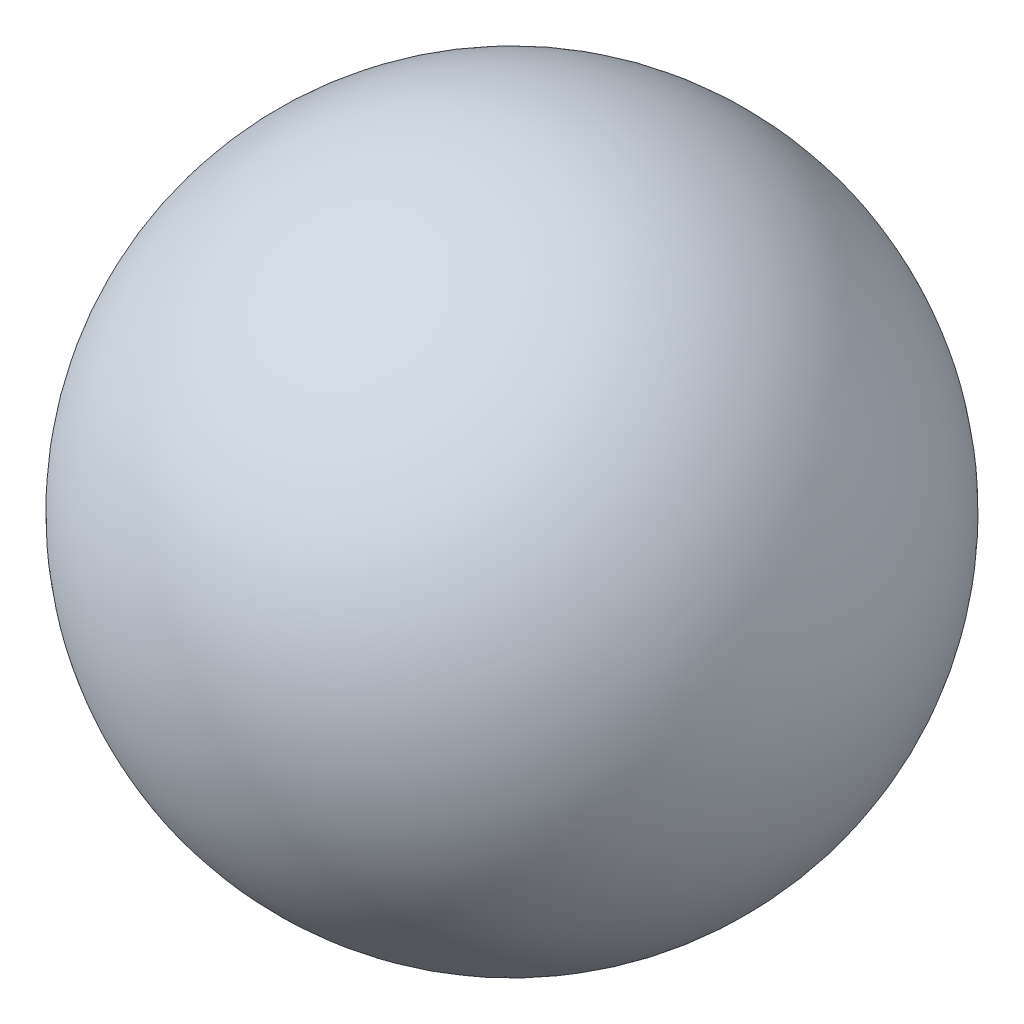
ISO-10303-21;
HEADER;
FILE_DESCRIPTION(('STEP AP214'),'2;1');
FILE_NAME('part.step','',(''),(''),'','','');
FILE_SCHEMA(('AUTOMOTIVE_DESIGN { 1 0 10303 214 1 1 1 1 }'));
ENDSEC;
DATA;
#1=APPLICATION_CONTEXT('core data for automotive mechanical design processes');
#2=APPLICATION_PROTOCOL_DEFINITION('international standard','automotive_design',2000,#1);
#3=PRODUCT_CONTEXT('',#1,'mechanical');
#4=PRODUCT('Part','Part','',(#3));
#5=PRODUCT_RELATED_PRODUCT_CATEGORY('part','',(#4));
#6=PRODUCT_DEFINITION_FORMATION('','',#4);
#7=PRODUCT_DEFINITION_CONTEXT('part definition',#1,'design');
#8=PRODUCT_DEFINITION('design','',#6,#7);
#9=PRODUCT_DEFINITION_SHAPE('','',#8);
#10=(LENGTH_UNIT() NAMED_UNIT(*) SI_UNIT(.MILLI.,.METRE.));
#11=(NAMED_UNIT(*) PLANE_ANGLE_UNIT() SI_UNIT($,.RADIAN.));
#12=(NAMED_UNIT(*) SI_UNIT($,.STERADIAN.) SOLID_ANGLE_UNIT());
#13=UNCERTAINTY_MEASURE_WITH_UNIT(LENGTH_MEASURE(1.E-05),#10,'distance_accuracy_value','');
#14=(GEOMETRIC_REPRESENTATION_CONTEXT(3) GLOBAL_UNCERTAINTY_ASSIGNED_CONTEXT((#13)) GLOBAL_UNIT_ASSIGNED_CONTEXT((#10,
#11,#12)) REPRESENTATION_CONTEXT('',''));
#15=CARTESIAN_POINT('',(0.,0.,0.));
#16=DIRECTION('',(0.,0.,1.));
#17=DIRECTION('',(1.,0.,0.));
#18=AXIS2_PLACEMENT_3D('',#15,#16,#17);
#19=CARTESIAN_POINT('',(0.,0.,0.));
#20=DIRECTION('',(0.,0.,-1.));
#21=DIRECTION('',(1.,0.,0.));
#22=AXIS2_PLACEMENT_3D('',#19,#20,#21);
#23=SPHERICAL_SURFACE('',#22,7.874);
#24=CARTESIAN_POINT('',(0.,0.,-7.874));
#25=VERTEX_POINT('',#24);
#26=VERTEX_LOOP('',#25);
#27=FACE_BOUND('',#26,.T.);
#28=ADVANCED_FACE('F33',(#27),#23,.T.);
#29=CLOSED_SHELL('',(#28));
#30=MANIFOLD_SOLID_BREP('B2',#29);
#31=ADVANCED_BREP_SHAPE_REPRESENTATION('',(#18,#30),#14);
#32=SHAPE_DEFINITION_REPRESENTATION(#9,#31);
ENDSEC;
END-ISO-10303-21;
